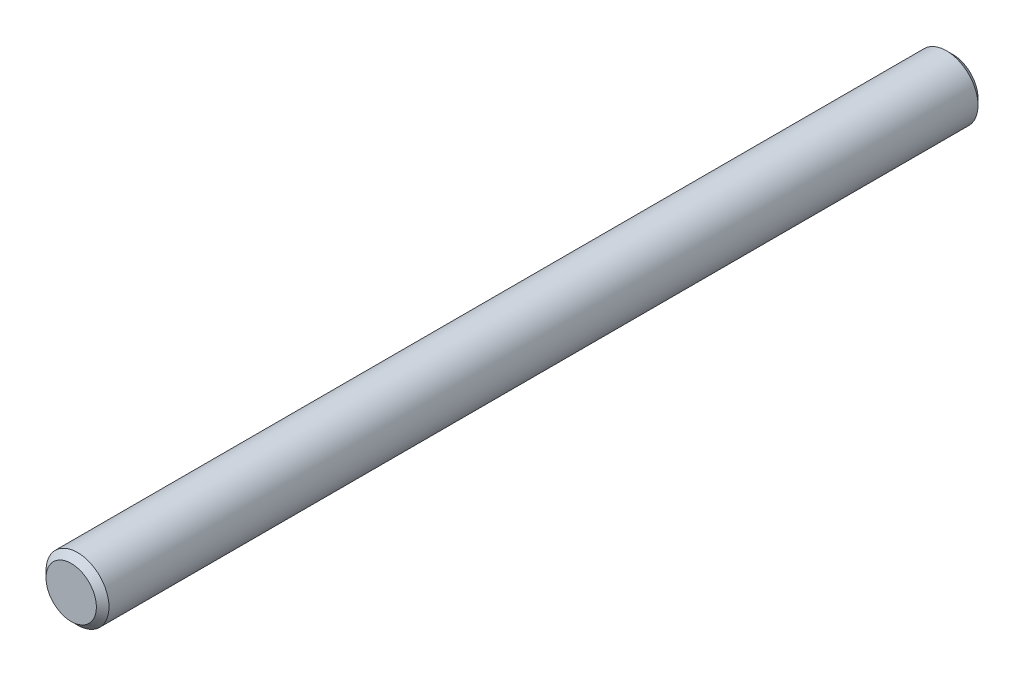
ISO-10303-21;
HEADER;
FILE_DESCRIPTION(('STEP AP214'),'2;1');
FILE_NAME('part.step','',(''),(''),'','','');
FILE_SCHEMA(('AUTOMOTIVE_DESIGN { 1 0 10303 214 1 1 1 1 }'));
ENDSEC;
DATA;
#1=APPLICATION_CONTEXT('core data for automotive mechanical design processes');
#2=APPLICATION_PROTOCOL_DEFINITION('international standard','automotive_design',2000,#1);
#3=PRODUCT_CONTEXT('',#1,'mechanical');
#4=PRODUCT('Part','Part','',(#3));
#5=PRODUCT_RELATED_PRODUCT_CATEGORY('part','',(#4));
#6=PRODUCT_DEFINITION_FORMATION('','',#4);
#7=PRODUCT_DEFINITION_CONTEXT('part definition',#1,'design');
#8=PRODUCT_DEFINITION('design','',#6,#7);
#9=PRODUCT_DEFINITION_SHAPE('','',#8);
#10=(LENGTH_UNIT() NAMED_UNIT(*) SI_UNIT(.MILLI.,.METRE.));
#11=(NAMED_UNIT(*) PLANE_ANGLE_UNIT() SI_UNIT($,.RADIAN.));
#12=(NAMED_UNIT(*) SI_UNIT($,.STERADIAN.) SOLID_ANGLE_UNIT());
#13=UNCERTAINTY_MEASURE_WITH_UNIT(LENGTH_MEASURE(1.E-05),#10,'distance_accuracy_value','');
#14=(GEOMETRIC_REPRESENTATION_CONTEXT(3) GLOBAL_UNCERTAINTY_ASSIGNED_CONTEXT((#13)) GLOBAL_UNIT_ASSIGNED_CONTEXT((#10,
#11,#12)) REPRESENTATION_CONTEXT('',''));
#15=CARTESIAN_POINT('',(0.,0.,0.));
#16=DIRECTION('',(0.,0.,1.));
#17=DIRECTION('',(1.,0.,0.));
#18=AXIS2_PLACEMENT_3D('',#15,#16,#17);
#19=CARTESIAN_POINT('',(0.,0.,28.));
#20=DIRECTION('',(0.,0.,-1.));
#21=DIRECTION('',(-1.,0.,0.));
#22=AXIS2_PLACEMENT_3D('',#19,#20,#21);
#23=CYLINDRICAL_SURFACE('',#22,0.999999999999999);
#24=CARTESIAN_POINT('',(0.,0.,0.199999999999999));
#25=DIRECTION('',(0.,0.,1.));
#26=DIRECTION('',(1.,0.,0.));
#27=AXIS2_PLACEMENT_3D('',#24,#25,#26);
#28=CIRCLE('',#27,0.999999999999999);
#29=CARTESIAN_POINT('',(0.999999999999999,0.,0.199999999999999));
#30=VERTEX_POINT('',#29);
#31=EDGE_CURVE('E40',#30,#30,#28,.T.);
#32=ORIENTED_EDGE('',*,*,#31,.T.);
#33=EDGE_LOOP('',(#32));
#34=FACE_BOUND('',#33,.T.);
#35=CARTESIAN_POINT('',(0.,0.,27.8));
#36=DIRECTION('',(0.,0.,1.));
#37=DIRECTION('',(1.,0.,0.));
#38=AXIS2_PLACEMENT_3D('',#35,#36,#37);
#39=CIRCLE('',#38,0.999999999999999);
#40=CARTESIAN_POINT('',(0.999999999999999,0.,27.8));
#41=VERTEX_POINT('',#40);
#42=EDGE_CURVE('E44',#41,#41,#39,.F.);
#43=ORIENTED_EDGE('',*,*,#42,.T.);
#44=EDGE_LOOP('',(#43));
#45=FACE_BOUND('',#44,.T.);
#46=ADVANCED_FACE('F30',(#34,#45),#23,.T.);
#47=CARTESIAN_POINT('',(0.,0.,28.));
#48=DIRECTION('',(0.,0.,1.));
#49=DIRECTION('',(1.,0.,0.));
#50=AXIS2_PLACEMENT_3D('',#47,#48,#49);
#51=PLANE('',#50);
#52=CARTESIAN_POINT('',(0.,0.,28.));
#53=DIRECTION('',(0.,0.,1.));
#54=DIRECTION('',(1.,0.,0.));
#55=AXIS2_PLACEMENT_3D('',#52,#53,#54);
#56=CIRCLE('',#55,0.8);
#57=CARTESIAN_POINT('',(0.8,0.,28.));
#58=VERTEX_POINT('',#57);
#59=EDGE_CURVE('E10',#58,#58,#56,.T.);
#60=ORIENTED_EDGE('',*,*,#59,.T.);
#61=EDGE_LOOP('',(#60));
#62=FACE_BOUND('',#61,.T.);
#63=ADVANCED_FACE('F63',(#62),#51,.T.);
#64=CARTESIAN_POINT('',(0.,0.,0.));
#65=DIRECTION('',(0.,0.,1.));
#66=DIRECTION('',(1.,0.,0.));
#67=AXIS2_PLACEMENT_3D('',#64,#65,#66);
#68=PLANE('',#67);
#69=CARTESIAN_POINT('',(0.,0.,0.));
#70=DIRECTION('',(0.,0.,1.));
#71=DIRECTION('',(1.,0.,0.));
#72=AXIS2_PLACEMENT_3D('',#69,#70,#71);
#73=CIRCLE('',#72,0.799999999999999);
#74=CARTESIAN_POINT('',(0.799999999999999,0.,0.));
#75=VERTEX_POINT('',#74);
#76=EDGE_CURVE('E36',#75,#75,#73,.F.);
#77=ORIENTED_EDGE('',*,*,#76,.T.);
#78=EDGE_LOOP('',(#77));
#79=FACE_BOUND('',#78,.T.);
#80=ADVANCED_FACE('F59',(#79),#68,.F.);
#81=CARTESIAN_POINT('',(0.,0.,0.199999999999999));
#82=DIRECTION('',(0.,0.,1.));
#83=DIRECTION('',(1.,0.,0.));
#84=AXIS2_PLACEMENT_3D('',#81,#82,#83);
#85=CONICAL_SURFACE('',#84,0.999999999999999,0.785398163397451);
#86=ORIENTED_EDGE('',*,*,#76,.F.);
#87=EDGE_LOOP('',(#86));
#88=FACE_BOUND('',#87,.T.);
#89=ORIENTED_EDGE('',*,*,#31,.F.);
#90=EDGE_LOOP('',(#89));
#91=FACE_BOUND('',#90,.T.);
#92=ADVANCED_FACE('F54',(#88,#91),#85,.T.);
#93=CARTESIAN_POINT('',(0.,0.,28.));
#94=DIRECTION('',(0.,0.,-1.));
#95=DIRECTION('',(-1.,0.,0.));
#96=AXIS2_PLACEMENT_3D('',#93,#94,#95);
#97=CONICAL_SURFACE('',#96,0.8,0.785398163397448);
#98=ORIENTED_EDGE('',*,*,#42,.F.);
#99=EDGE_LOOP('',(#98));
#100=FACE_BOUND('',#99,.T.);
#101=ORIENTED_EDGE('',*,*,#59,.F.);
#102=EDGE_LOOP('',(#101));
#103=FACE_BOUND('',#102,.T.);
#104=ADVANCED_FACE('F51',(#100,#103),#97,.T.);
#105=CLOSED_SHELL('',(#46,#63,#80,#92,#104));
#106=MANIFOLD_SOLID_BREP('B2',#105);
#107=ADVANCED_BREP_SHAPE_REPRESENTATION('',(#18,#106),#14);
#108=SHAPE_DEFINITION_REPRESENTATION(#9,#107);
ENDSEC;
END-ISO-10303-21;
